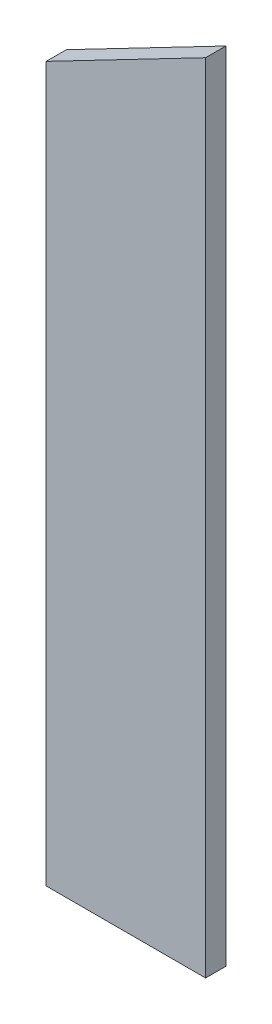
ISO-10303-21;
HEADER;
FILE_DESCRIPTION(('STEP AP214'),'2;1');
FILE_NAME('part.step','',(''),(''),'','','');
FILE_SCHEMA(('AUTOMOTIVE_DESIGN { 1 0 10303 214 1 1 1 1 }'));
ENDSEC;
DATA;
#1=APPLICATION_CONTEXT('core data for automotive mechanical design processes');
#2=APPLICATION_PROTOCOL_DEFINITION('international standard','automotive_design',2000,#1);
#3=PRODUCT_CONTEXT('',#1,'mechanical');
#4=PRODUCT('Part','Part','',(#3));
#5=PRODUCT_RELATED_PRODUCT_CATEGORY('part','',(#4));
#6=PRODUCT_DEFINITION_FORMATION('','',#4);
#7=PRODUCT_DEFINITION_CONTEXT('part definition',#1,'design');
#8=PRODUCT_DEFINITION('design','',#6,#7);
#9=PRODUCT_DEFINITION_SHAPE('','',#8);
#10=(LENGTH_UNIT() NAMED_UNIT(*) SI_UNIT(.MILLI.,.METRE.));
#11=(NAMED_UNIT(*) PLANE_ANGLE_UNIT() SI_UNIT($,.RADIAN.));
#12=(NAMED_UNIT(*) SI_UNIT($,.STERADIAN.) SOLID_ANGLE_UNIT());
#13=UNCERTAINTY_MEASURE_WITH_UNIT(LENGTH_MEASURE(1.E-05),#10,'distance_accuracy_value','');
#14=(GEOMETRIC_REPRESENTATION_CONTEXT(3) GLOBAL_UNCERTAINTY_ASSIGNED_CONTEXT((#13)) GLOBAL_UNIT_ASSIGNED_CONTEXT((#10,
#11,#12)) REPRESENTATION_CONTEXT('',''));
#15=CARTESIAN_POINT('',(0.,0.,0.));
#16=DIRECTION('',(0.,0.,1.));
#17=DIRECTION('',(1.,0.,0.));
#18=AXIS2_PLACEMENT_3D('',#15,#16,#17);
#19=CARTESIAN_POINT('',(25.,0.,6.35));
#20=DIRECTION('',(1.,0.,0.));
#21=DIRECTION('',(0.,1.,0.));
#22=AXIS2_PLACEMENT_3D('',#19,#20,#21);
#23=PLANE('',#22);
#24=DIRECTION('',(0.,-1.,0.));
#25=VECTOR('',#24,1.);
#26=CARTESIAN_POINT('',(25.,0.,0.));
#27=LINE('',#26,#25);
#28=CARTESIAN_POINT('',(25.,138.,0.));
#29=VERTEX_POINT('',#28);
#30=CARTESIAN_POINT('',(25.,-112.,0.));
#31=VERTEX_POINT('',#30);
#32=EDGE_CURVE('E102',#29,#31,#27,.T.);
#33=ORIENTED_EDGE('',*,*,#32,.F.);
#34=DIRECTION('',(0.,0.,-1.));
#35=VECTOR('',#34,1.);
#36=CARTESIAN_POINT('',(25.,138.,6.35));
#37=LINE('',#36,#35);
#38=CARTESIAN_POINT('',(25.,138.,6.35));
#39=VERTEX_POINT('',#38);
#40=EDGE_CURVE('E11',#39,#29,#37,.T.);
#41=ORIENTED_EDGE('',*,*,#40,.F.);
#42=DIRECTION('',(0.,-1.,0.));
#43=VECTOR('',#42,1.);
#44=CARTESIAN_POINT('',(25.,0.,6.35));
#45=LINE('',#44,#43);
#46=CARTESIAN_POINT('',(25.,-112.,6.35));
#47=VERTEX_POINT('',#46);
#48=EDGE_CURVE('E94',#39,#47,#45,.T.);
#49=ORIENTED_EDGE('',*,*,#48,.T.);
#50=DIRECTION('',(0.,0.,-1.));
#51=VECTOR('',#50,1.);
#52=CARTESIAN_POINT('',(25.,-112.,6.35));
#53=LINE('',#52,#51);
#54=EDGE_CURVE('E55',#47,#31,#53,.T.);
#55=ORIENTED_EDGE('',*,*,#54,.T.);
#56=EDGE_LOOP('',(#33,#41,#49,#55));
#57=FACE_BOUND('',#56,.T.);
#58=ADVANCED_FACE('F39',(#57),#23,.T.);
#59=CARTESIAN_POINT('',(-51.1649874055416,98.3942065491184,6.35));
#60=DIRECTION('',(-0.46135273664199,0.887216801234595,0.));
#61=DIRECTION('',(-0.887216801234595,-0.46135273664199,0.));
#62=AXIS2_PLACEMENT_3D('',#59,#60,#61);
#63=PLANE('',#62);
#64=DIRECTION('',(0.887216801234595,0.46135273664199,0.));
#65=VECTOR('',#64,1.);
#66=CARTESIAN_POINT('',(-51.1649874055416,98.3942065491184,0.));
#67=LINE('',#66,#65);
#68=CARTESIAN_POINT('',(-25.,112.,0.));
#69=VERTEX_POINT('',#68);
#70=EDGE_CURVE('E85',#69,#29,#67,.T.);
#71=ORIENTED_EDGE('',*,*,#70,.F.);
#72=DIRECTION('',(0.,0.,-1.));
#73=VECTOR('',#72,1.);
#74=CARTESIAN_POINT('',(-25.,112.,6.35));
#75=LINE('',#74,#73);
#76=CARTESIAN_POINT('',(-25.,112.,6.35));
#77=VERTEX_POINT('',#76);
#78=EDGE_CURVE('E47',#77,#69,#75,.T.);
#79=ORIENTED_EDGE('',*,*,#78,.F.);
#80=DIRECTION('',(0.887216801234595,0.46135273664199,0.));
#81=VECTOR('',#80,1.);
#82=CARTESIAN_POINT('',(-51.1649874055416,98.3942065491184,6.35));
#83=LINE('',#82,#81);
#84=EDGE_CURVE('E83',#77,#39,#83,.T.);
#85=ORIENTED_EDGE('',*,*,#84,.T.);
#86=ORIENTED_EDGE('',*,*,#40,.T.);
#87=EDGE_LOOP('',(#71,#79,#85,#86));
#88=FACE_BOUND('',#87,.T.);
#89=ADVANCED_FACE('F82',(#88),#63,.T.);
#90=CARTESIAN_POINT('',(-25.,0.,6.35));
#91=DIRECTION('',(-1.,0.,0.));
#92=DIRECTION('',(0.,0.,1.));
#93=AXIS2_PLACEMENT_3D('',#90,#91,#92);
#94=PLANE('',#93);
#95=DIRECTION('',(0.,1.,0.));
#96=VECTOR('',#95,1.);
#97=CARTESIAN_POINT('',(-25.,0.,0.));
#98=LINE('',#97,#96);
#99=CARTESIAN_POINT('',(-25.,-112.,0.));
#100=VERTEX_POINT('',#99);
#101=EDGE_CURVE('E105',#100,#69,#98,.T.);
#102=ORIENTED_EDGE('',*,*,#101,.F.);
#103=DIRECTION('',(0.,0.,-1.));
#104=VECTOR('',#103,1.);
#105=CARTESIAN_POINT('',(-25.,-112.,6.35));
#106=LINE('',#105,#104);
#107=CARTESIAN_POINT('',(-25.,-112.,6.35));
#108=VERTEX_POINT('',#107);
#109=EDGE_CURVE('E68',#108,#100,#106,.T.);
#110=ORIENTED_EDGE('',*,*,#109,.F.);
#111=DIRECTION('',(0.,1.,0.));
#112=VECTOR('',#111,1.);
#113=CARTESIAN_POINT('',(-25.,0.,6.35));
#114=LINE('',#113,#112);
#115=EDGE_CURVE('E93',#108,#77,#114,.T.);
#116=ORIENTED_EDGE('',*,*,#115,.T.);
#117=ORIENTED_EDGE('',*,*,#78,.T.);
#118=EDGE_LOOP('',(#102,#110,#116,#117));
#119=FACE_BOUND('',#118,.T.);
#120=ADVANCED_FACE('F96',(#119),#94,.T.);
#121=CARTESIAN_POINT('',(0.,-112.,6.35));
#122=DIRECTION('',(0.,-1.,0.));
#123=DIRECTION('',(0.,0.,-1.));
#124=AXIS2_PLACEMENT_3D('',#121,#122,#123);
#125=PLANE('',#124);
#126=DIRECTION('',(-1.,0.,0.));
#127=VECTOR('',#126,1.);
#128=CARTESIAN_POINT('',(0.,-112.,0.));
#129=LINE('',#128,#127);
#130=EDGE_CURVE('E107',#31,#100,#129,.T.);
#131=ORIENTED_EDGE('',*,*,#130,.F.);
#132=ORIENTED_EDGE('',*,*,#54,.F.);
#133=DIRECTION('',(-1.,0.,0.));
#134=VECTOR('',#133,1.);
#135=CARTESIAN_POINT('',(0.,-112.,6.35));
#136=LINE('',#135,#134);
#137=EDGE_CURVE('E97',#47,#108,#136,.T.);
#138=ORIENTED_EDGE('',*,*,#137,.T.);
#139=ORIENTED_EDGE('',*,*,#109,.T.);
#140=EDGE_LOOP('',(#131,#132,#138,#139));
#141=FACE_BOUND('',#140,.T.);
#142=ADVANCED_FACE('F112',(#141),#125,.T.);
#143=CARTESIAN_POINT('',(0.,0.,6.35));
#144=DIRECTION('',(0.,0.,1.));
#145=DIRECTION('',(1.,0.,0.));
#146=AXIS2_PLACEMENT_3D('',#143,#144,#145);
#147=PLANE('',#146);
#148=ORIENTED_EDGE('',*,*,#48,.F.);
#149=ORIENTED_EDGE('',*,*,#84,.F.);
#150=ORIENTED_EDGE('',*,*,#115,.F.);
#151=ORIENTED_EDGE('',*,*,#137,.F.);
#152=EDGE_LOOP('',(#148,#149,#150,#151));
#153=FACE_BOUND('',#152,.T.);
#154=ADVANCED_FACE('F91',(#153),#147,.T.);
#155=CARTESIAN_POINT('',(0.,0.,0.));
#156=DIRECTION('',(0.,0.,1.));
#157=DIRECTION('',(1.,0.,0.));
#158=AXIS2_PLACEMENT_3D('',#155,#156,#157);
#159=PLANE('',#158);
#160=ORIENTED_EDGE('',*,*,#32,.T.);
#161=ORIENTED_EDGE('',*,*,#130,.T.);
#162=ORIENTED_EDGE('',*,*,#101,.T.);
#163=ORIENTED_EDGE('',*,*,#70,.T.);
#164=EDGE_LOOP('',(#160,#161,#162,#163));
#165=FACE_BOUND('',#164,.T.);
#166=ADVANCED_FACE('F119',(#165),#159,.F.);
#167=CLOSED_SHELL('',(#58,#89,#120,#142,#154,#166));
#168=MANIFOLD_SOLID_BREP('B2',#167);
#169=ADVANCED_BREP_SHAPE_REPRESENTATION('',(#18,#168),#14);
#170=SHAPE_DEFINITION_REPRESENTATION(#9,#169);
ENDSEC;
END-ISO-10303-21;
